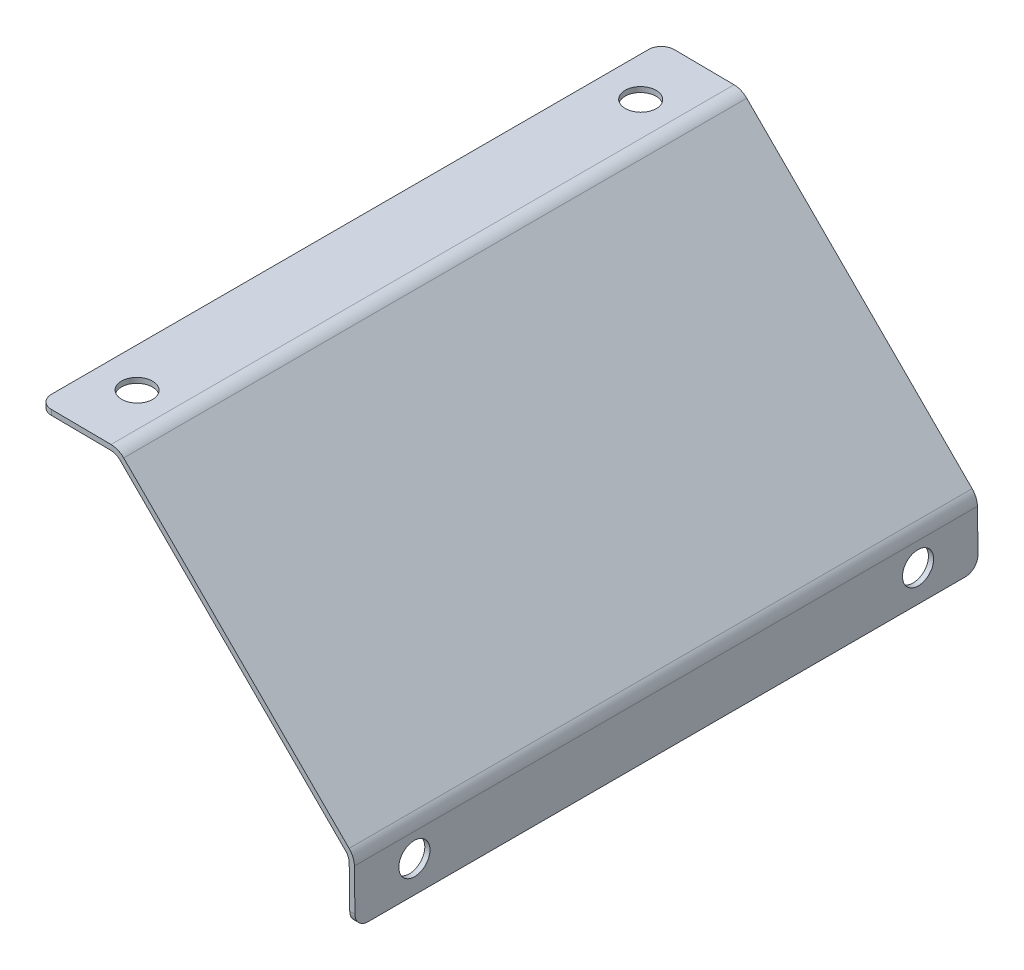
ISO-10303-21;
HEADER;
FILE_DESCRIPTION(('STEP AP214'),'2;1');
FILE_NAME('part.step','',(''),(''),'','','');
FILE_SCHEMA(('AUTOMOTIVE_DESIGN { 1 0 10303 214 1 1 1 1 }'));
ENDSEC;
DATA;
#1=APPLICATION_CONTEXT('core data for automotive mechanical design processes');
#2=APPLICATION_PROTOCOL_DEFINITION('international standard','automotive_design',2000,#1);
#3=PRODUCT_CONTEXT('',#1,'mechanical');
#4=PRODUCT('Part','Part','',(#3));
#5=PRODUCT_RELATED_PRODUCT_CATEGORY('part','',(#4));
#6=PRODUCT_DEFINITION_FORMATION('','',#4);
#7=PRODUCT_DEFINITION_CONTEXT('part definition',#1,'design');
#8=PRODUCT_DEFINITION('design','',#6,#7);
#9=PRODUCT_DEFINITION_SHAPE('','',#8);
#10=(LENGTH_UNIT() NAMED_UNIT(*) SI_UNIT(.MILLI.,.METRE.));
#11=(NAMED_UNIT(*) PLANE_ANGLE_UNIT() SI_UNIT($,.RADIAN.));
#12=(NAMED_UNIT(*) SI_UNIT($,.STERADIAN.) SOLID_ANGLE_UNIT());
#13=UNCERTAINTY_MEASURE_WITH_UNIT(LENGTH_MEASURE(1.E-05),#10,'distance_accuracy_value','');
#14=(GEOMETRIC_REPRESENTATION_CONTEXT(3) GLOBAL_UNCERTAINTY_ASSIGNED_CONTEXT((#13)) GLOBAL_UNIT_ASSIGNED_CONTEXT((#10,
#11,#12)) REPRESENTATION_CONTEXT('',''));
#15=CARTESIAN_POINT('',(0.,0.,0.));
#16=DIRECTION('',(0.,0.,1.));
#17=DIRECTION('',(1.,0.,0.));
#18=AXIS2_PLACEMENT_3D('',#15,#16,#17);
#19=CARTESIAN_POINT('',(114.734409216363,27.9027269042712,287.657206746833));
#20=DIRECTION('',(0.,0.,-1.));
#21=DIRECTION('',(-1.,0.,0.));
#22=AXIS2_PLACEMENT_3D('',#19,#20,#21);
#23=CYLINDRICAL_SURFACE('',#22,5.);
#24=DIRECTION('',(0.,0.,-1.));
#25=VECTOR('',#24,1.);
#26=CARTESIAN_POINT('',(119.734006878612,27.966155727616,287.657206746833));
#27=LINE('',#26,#25);
#28=CARTESIAN_POINT('',(119.734006878612,27.966155727616,120.));
#29=VERTEX_POINT('',#28);
#30=CARTESIAN_POINT('',(119.734006878612,27.966155727616,-120.));
#31=VERTEX_POINT('',#30);
#32=EDGE_CURVE('E162',#29,#31,#27,.T.);
#33=ORIENTED_EDGE('',*,*,#32,.F.);
#34=CARTESIAN_POINT('',(114.734409216363,27.9027269042712,120.));
#35=DIRECTION('',(0.,0.,-1.));
#36=DIRECTION('',(-1.,0.,0.));
#37=AXIS2_PLACEMENT_3D('',#34,#35,#36);
#38=CIRCLE('',#37,5.);
#39=CARTESIAN_POINT('',(118.269943122295,31.438260810204,120.));
#40=VERTEX_POINT('',#39);
#41=EDGE_CURVE('E157',#29,#40,#38,.F.);
#42=ORIENTED_EDGE('',*,*,#41,.T.);
#43=DIRECTION('',(0.,0.,-1.));
#44=VECTOR('',#43,1.);
#45=CARTESIAN_POINT('',(118.269943122295,31.438260810204,287.657206746833));
#46=LINE('',#45,#44);
#47=CARTESIAN_POINT('',(118.269943122295,31.438260810204,-120.));
#48=VERTEX_POINT('',#47);
#49=EDGE_CURVE('E152',#40,#48,#46,.T.);
#50=ORIENTED_EDGE('',*,*,#49,.T.);
#51=CARTESIAN_POINT('',(114.734409216363,27.9027269042712,-120.));
#52=DIRECTION('',(0.,0.,1.));
#53=DIRECTION('',(1.,0.,0.));
#54=AXIS2_PLACEMENT_3D('',#51,#52,#53);
#55=CIRCLE('',#54,5.);
#56=EDGE_CURVE('E155',#31,#48,#55,.T.);
#57=ORIENTED_EDGE('',*,*,#56,.F.);
#58=EDGE_LOOP('',(#33,#42,#50,#57));
#59=FACE_BOUND('',#58,.T.);
#60=ADVANCED_FACE('F35',(#59),#23,.F.);
#61=CARTESIAN_POINT('',(31.444362751566,118.263841180933,287.657206746833));
#62=DIRECTION('',(0.707106781186548,0.707106781186547,0.));
#63=DIRECTION('',(-0.707106781186547,0.707106781186548,0.));
#64=AXIS2_PLACEMENT_3D('',#61,#62,#63);
#65=PLANE('',#64);
#66=ORIENTED_EDGE('',*,*,#49,.F.);
#67=DIRECTION('',(-0.707106781186547,0.707106781186548,0.));
#68=VECTOR('',#67,1.);
#69=CARTESIAN_POINT('',(31.4443627515659,118.263841180933,120.));
#70=LINE('',#69,#68);
#71=CARTESIAN_POINT('',(31.444362751566,118.263841180933,120.));
#72=VERTEX_POINT('',#71);
#73=EDGE_CURVE('E182',#40,#72,#70,.T.);
#74=ORIENTED_EDGE('',*,*,#73,.T.);
#75=DIRECTION('',(0.,0.,-1.));
#76=VECTOR('',#75,1.);
#77=CARTESIAN_POINT('',(31.444362751566,118.263841180933,287.657206746833));
#78=LINE('',#77,#76);
#79=CARTESIAN_POINT('',(31.444362751566,118.263841180933,-120.));
#80=VERTEX_POINT('',#79);
#81=EDGE_CURVE('E161',#72,#80,#78,.T.);
#82=ORIENTED_EDGE('',*,*,#81,.T.);
#83=DIRECTION('',(-0.707106781186547,0.707106781186548,0.));
#84=VECTOR('',#83,1.);
#85=CARTESIAN_POINT('',(31.4443627515659,118.263841180933,-120.));
#86=LINE('',#85,#84);
#87=EDGE_CURVE('E167',#48,#80,#86,.T.);
#88=ORIENTED_EDGE('',*,*,#87,.F.);
#89=EDGE_LOOP('',(#66,#74,#82,#88));
#90=FACE_BOUND('',#89,.T.);
#91=ADVANCED_FACE('F173',(#90),#65,.F.);
#92=CARTESIAN_POINT('',(27.9088288456332,114.728307275001,287.657206746833));
#93=DIRECTION('',(0.,0.,-1.));
#94=DIRECTION('',(-1.,0.,0.));
#95=AXIS2_PLACEMENT_3D('',#92,#93,#94);
#96=CYLINDRICAL_SURFACE('',#95,5.00000000000001);
#97=ORIENTED_EDGE('',*,*,#81,.F.);
#98=CARTESIAN_POINT('',(27.9088288456332,114.728307275001,120.));
#99=DIRECTION('',(0.,0.,-1.));
#100=DIRECTION('',(-1.,0.,0.));
#101=AXIS2_PLACEMENT_3D('',#98,#99,#100);
#102=CIRCLE('',#101,5.00000000000001);
#103=CARTESIAN_POINT('',(27.9574592232539,119.728070778045,120.));
#104=VERTEX_POINT('',#103);
#105=EDGE_CURVE('E184',#72,#104,#102,.F.);
#106=ORIENTED_EDGE('',*,*,#105,.T.);
#107=DIRECTION('',(0.,0.,-1.));
#108=VECTOR('',#107,1.);
#109=CARTESIAN_POINT('',(27.9574592232539,119.728070778045,287.657206746833));
#110=LINE('',#109,#108);
#111=CARTESIAN_POINT('',(27.9574592232539,119.728070778045,-120.));
#112=VERTEX_POINT('',#111);
#113=EDGE_CURVE('E206',#104,#112,#110,.T.);
#114=ORIENTED_EDGE('',*,*,#113,.T.);
#115=CARTESIAN_POINT('',(27.9088288456332,114.728307275001,-120.));
#116=DIRECTION('',(0.,0.,1.));
#117=DIRECTION('',(1.,0.,0.));
#118=AXIS2_PLACEMENT_3D('',#115,#116,#117);
#119=CIRCLE('',#118,5.00000000000001);
#120=EDGE_CURVE('E175',#80,#112,#119,.T.);
#121=ORIENTED_EDGE('',*,*,#120,.F.);
#122=EDGE_LOOP('',(#97,#106,#114,#121));
#123=FACE_BOUND('',#122,.T.);
#124=ADVANCED_FACE('F341',(#123),#96,.F.);
#125=CARTESIAN_POINT('',(0.,120.,287.657206746833));
#126=DIRECTION('',(0.00972607552414292,0.999952700608833,0.));
#127=DIRECTION('',(-0.999952700608833,0.00972607552414292,0.));
#128=AXIS2_PLACEMENT_3D('',#125,#126,#127);
#129=PLANE('',#128);
#130=CARTESIAN_POINT('',(14.9985810518235,119.8541157677,-97.));
#131=DIRECTION('',(0.00972607552414292,0.999952700608833,0.));
#132=DIRECTION('',(-0.999952700608833,0.00972607552414292,0.));
#133=AXIS2_PLACEMENT_3D('',#130,#131,#132);
#134=CIRCLE('',#133,6.);
#135=CARTESIAN_POINT('',(8.99886484817047,119.912472220844,-97.));
#136=VERTEX_POINT('',#135);
#137=EDGE_CURVE('E382',#136,#136,#134,.T.);
#138=ORIENTED_EDGE('',*,*,#137,.T.);
#139=EDGE_LOOP('',(#138));
#140=FACE_BOUND('',#139,.T.);
#141=CARTESIAN_POINT('',(14.9985810518235,119.8541157677,97.));
#142=DIRECTION('',(0.00972607552414292,0.999952700608833,0.));
#143=DIRECTION('',(-0.999952700608833,0.00972607552414292,0.));
#144=AXIS2_PLACEMENT_3D('',#141,#142,#143);
#145=CIRCLE('',#144,6.);
#146=CARTESIAN_POINT('',(8.99886484817047,119.912472220844,97.));
#147=VERTEX_POINT('',#146);
#148=EDGE_CURVE('E386',#147,#147,#145,.T.);
#149=ORIENTED_EDGE('',*,*,#148,.T.);
#150=EDGE_LOOP('',(#149));
#151=FACE_BOUND('',#150,.T.);
#152=DIRECTION('',(-0.999952700608833,0.00972607552414292,0.));
#153=VECTOR('',#152,1.);
#154=CARTESIAN_POINT('',(0.,120.,120.));
#155=LINE('',#154,#153);
#156=CARTESIAN_POINT('',(4.99976350304416,119.951369622379,120.));
#157=VERTEX_POINT('',#156);
#158=EDGE_CURVE('E187',#104,#157,#155,.T.);
#159=ORIENTED_EDGE('',*,*,#158,.T.);
#160=CARTESIAN_POINT('',(4.99976350304416,119.951369622379,115.));
#161=DIRECTION('',(0.00972607552414292,0.999952700608833,0.));
#162=DIRECTION('',(-0.999952700608833,0.00972607552414292,0.));
#163=AXIS2_PLACEMENT_3D('',#160,#161,#162);
#164=CIRCLE('',#163,5.);
#165=CARTESIAN_POINT('',(0.,120.,115.));
#166=VERTEX_POINT('',#165);
#167=EDGE_CURVE('E251',#157,#166,#164,.F.);
#168=ORIENTED_EDGE('',*,*,#167,.T.);
#169=DIRECTION('',(0.,0.,-1.));
#170=VECTOR('',#169,1.);
#171=CARTESIAN_POINT('',(0.,120.,287.657206746833));
#172=LINE('',#171,#170);
#173=CARTESIAN_POINT('',(0.,120.,-115.));
#174=VERTEX_POINT('',#173);
#175=EDGE_CURVE('E208',#166,#174,#172,.T.);
#176=ORIENTED_EDGE('',*,*,#175,.T.);
#177=CARTESIAN_POINT('',(4.99976350304416,119.951369622379,-115.));
#178=DIRECTION('',(0.00972607552414292,0.999952700608833,0.));
#179=DIRECTION('',(-0.999952700608833,0.00972607552414292,0.));
#180=AXIS2_PLACEMENT_3D('',#177,#178,#179);
#181=CIRCLE('',#180,5.);
#182=CARTESIAN_POINT('',(4.99976350304417,119.951369622379,-120.));
#183=VERTEX_POINT('',#182);
#184=EDGE_CURVE('E249',#174,#183,#181,.F.);
#185=ORIENTED_EDGE('',*,*,#184,.T.);
#186=DIRECTION('',(-0.999952700608833,0.00972607552414292,0.));
#187=VECTOR('',#186,1.);
#188=CARTESIAN_POINT('',(0.,120.,-120.));
#189=LINE('',#188,#187);
#190=EDGE_CURVE('E177',#112,#183,#189,.T.);
#191=ORIENTED_EDGE('',*,*,#190,.F.);
#192=ORIENTED_EDGE('',*,*,#113,.F.);
#193=EDGE_LOOP('',(#159,#168,#176,#185,#191,#192));
#194=FACE_BOUND('',#193,.T.);
#195=ADVANCED_FACE('F294',(#140,#151,#194),#129,.F.);
#196=CARTESIAN_POINT('',(0.,120.,287.657206746833));
#197=DIRECTION('',(-0.999952700608833,0.00972607552414292,0.));
#198=DIRECTION('',(-0.00972607552414292,-0.999952700608833,0.));
#199=AXIS2_PLACEMENT_3D('',#196,#197,#198);
#200=PLANE('',#199);
#201=ORIENTED_EDGE('',*,*,#175,.F.);
#202=DIRECTION('',(-0.00972607552414292,-0.999952700608833,0.));
#203=VECTOR('',#202,1.);
#204=CARTESIAN_POINT('',(0.0194521510482842,121.999905401218,115.));
#205=LINE('',#204,#203);
#206=CARTESIAN_POINT('',(0.0194521510482842,121.999905401218,115.));
#207=VERTEX_POINT('',#206);
#208=EDGE_CURVE('E256',#166,#207,#205,.F.);
#209=ORIENTED_EDGE('',*,*,#208,.T.);
#210=DIRECTION('',(0.,0.,-1.));
#211=VECTOR('',#210,1.);
#212=CARTESIAN_POINT('',(0.0194521510482842,121.999905401218,287.657206746833));
#213=LINE('',#212,#211);
#214=CARTESIAN_POINT('',(0.0194521510482842,121.999905401218,-115.));
#215=VERTEX_POINT('',#214);
#216=EDGE_CURVE('E211',#207,#215,#213,.T.);
#217=ORIENTED_EDGE('',*,*,#216,.T.);
#218=DIRECTION('',(-0.00972607552414292,-0.999952700608833,0.));
#219=VECTOR('',#218,1.);
#220=CARTESIAN_POINT('',(0.,120.,-115.));
#221=LINE('',#220,#219);
#222=EDGE_CURVE('E253',#215,#174,#221,.T.);
#223=ORIENTED_EDGE('',*,*,#222,.T.);
#224=EDGE_LOOP('',(#201,#209,#217,#223));
#225=FACE_BOUND('',#224,.T.);
#226=ADVANCED_FACE('F292',(#225),#200,.T.);
#227=CARTESIAN_POINT('',(0.0194521510482842,121.999905401218,287.657206746833));
#228=DIRECTION('',(0.00972607552414292,0.999952700608833,0.));
#229=DIRECTION('',(-0.999952700608833,0.00972607552414292,0.));
#230=AXIS2_PLACEMENT_3D('',#227,#228,#229);
#231=PLANE('',#230);
#232=CARTESIAN_POINT('',(15.0180332028718,121.854021168917,-97.));
#233=DIRECTION('',(0.00972607552414292,0.999952700608833,0.));
#234=DIRECTION('',(-0.999952700608833,0.00972607552414292,0.));
#235=AXIS2_PLACEMENT_3D('',#232,#233,#234);
#236=CIRCLE('',#235,6.);
#237=CARTESIAN_POINT('',(9.01831699921876,121.912377622062,-97.));
#238=VERTEX_POINT('',#237);
#239=EDGE_CURVE('E379',#238,#238,#236,.T.);
#240=ORIENTED_EDGE('',*,*,#239,.F.);
#241=EDGE_LOOP('',(#240));
#242=FACE_BOUND('',#241,.T.);
#243=CARTESIAN_POINT('',(15.0180332028718,121.854021168917,97.));
#244=DIRECTION('',(0.00972607552414292,0.999952700608833,0.));
#245=DIRECTION('',(-0.999952700608833,0.00972607552414292,0.));
#246=AXIS2_PLACEMENT_3D('',#243,#244,#245);
#247=CIRCLE('',#246,6.);
#248=CARTESIAN_POINT('',(9.01831699921876,121.912377622062,97.));
#249=VERTEX_POINT('',#248);
#250=EDGE_CURVE('E383',#249,#249,#247,.T.);
#251=ORIENTED_EDGE('',*,*,#250,.F.);
#252=EDGE_LOOP('',(#251));
#253=FACE_BOUND('',#252,.T.);
#254=ORIENTED_EDGE('',*,*,#216,.F.);
#255=CARTESIAN_POINT('',(5.01921565409245,121.951275023597,115.));
#256=DIRECTION('',(0.00972607552414292,0.999952700608833,0.));
#257=DIRECTION('',(-0.999952700608833,0.00972607552414292,0.));
#258=AXIS2_PLACEMENT_3D('',#255,#256,#257);
#259=CIRCLE('',#258,5.);
#260=CARTESIAN_POINT('',(5.01921565409245,121.951275023597,120.));
#261=VERTEX_POINT('',#260);
#262=EDGE_CURVE('E44',#207,#261,#259,.T.);
#263=ORIENTED_EDGE('',*,*,#262,.T.);
#264=DIRECTION('',(-0.999952700608833,0.00972607552414292,0.));
#265=VECTOR('',#264,1.);
#266=CARTESIAN_POINT('',(0.0194521510482454,121.999905401218,120.));
#267=LINE('',#266,#265);
#268=CARTESIAN_POINT('',(27.9769113743022,121.727976179263,120.));
#269=VERTEX_POINT('',#268);
#270=EDGE_CURVE('E190',#269,#261,#267,.T.);
#271=ORIENTED_EDGE('',*,*,#270,.F.);
#272=DIRECTION('',(0.,0.,-1.));
#273=VECTOR('',#272,1.);
#274=CARTESIAN_POINT('',(27.9769113743022,121.727976179262,287.657206746833));
#275=LINE('',#274,#273);
#276=CARTESIAN_POINT('',(27.9769113743022,121.727976179262,-120.));
#277=VERTEX_POINT('',#276);
#278=EDGE_CURVE('E213',#269,#277,#275,.T.);
#279=ORIENTED_EDGE('',*,*,#278,.T.);
#280=DIRECTION('',(-0.999952700608833,0.00972607552414292,0.));
#281=VECTOR('',#280,1.);
#282=CARTESIAN_POINT('',(0.0194521510482454,121.999905401218,-120.));
#283=LINE('',#282,#281);
#284=CARTESIAN_POINT('',(5.01921565409245,121.951275023597,-120.));
#285=VERTEX_POINT('',#284);
#286=EDGE_CURVE('E284',#277,#285,#283,.T.);
#287=ORIENTED_EDGE('',*,*,#286,.T.);
#288=CARTESIAN_POINT('',(5.01921565409245,121.951275023597,-115.));
#289=DIRECTION('',(0.00972607552414292,0.999952700608833,0.));
#290=DIRECTION('',(-0.999952700608833,0.00972607552414292,0.));
#291=AXIS2_PLACEMENT_3D('',#288,#289,#290);
#292=CIRCLE('',#291,5.);
#293=EDGE_CURVE('E57',#285,#215,#292,.T.);
#294=ORIENTED_EDGE('',*,*,#293,.T.);
#295=EDGE_LOOP('',(#254,#263,#271,#279,#287,#294));
#296=FACE_BOUND('',#295,.T.);
#297=ADVANCED_FACE('F304',(#242,#253,#296),#231,.T.);
#298=CARTESIAN_POINT('',(27.9088288456332,114.728307275001,287.657206746833));
#299=DIRECTION('',(0.,0.,-1.));
#300=DIRECTION('',(-1.,0.,0.));
#301=AXIS2_PLACEMENT_3D('',#298,#299,#300);
#302=CYLINDRICAL_SURFACE('',#301,7.00000000000001);
#303=CARTESIAN_POINT('',(27.9088288456332,114.728307275001,120.));
#304=DIRECTION('',(0.,0.,-1.));
#305=DIRECTION('',(-1.,0.,0.));
#306=AXIS2_PLACEMENT_3D('',#303,#304,#305);
#307=CIRCLE('',#306,7.00000000000001);
#308=CARTESIAN_POINT('',(32.8585763139391,119.678054743307,120.));
#309=VERTEX_POINT('',#308);
#310=EDGE_CURVE('E193',#309,#269,#307,.F.);
#311=ORIENTED_EDGE('',*,*,#310,.F.);
#312=DIRECTION('',(0.,0.,-1.));
#313=VECTOR('',#312,1.);
#314=CARTESIAN_POINT('',(32.858576313939,119.678054743306,287.657206746833));
#315=LINE('',#314,#313);
#316=CARTESIAN_POINT('',(32.858576313939,119.678054743306,-120.));
#317=VERTEX_POINT('',#316);
#318=EDGE_CURVE('E215',#309,#317,#315,.T.);
#319=ORIENTED_EDGE('',*,*,#318,.T.);
#320=CARTESIAN_POINT('',(27.9088288456332,114.728307275001,-120.));
#321=DIRECTION('',(0.,0.,1.));
#322=DIRECTION('',(1.,0.,0.));
#323=AXIS2_PLACEMENT_3D('',#320,#321,#322);
#324=CIRCLE('',#323,7.00000000000001);
#325=EDGE_CURVE('E281',#317,#277,#324,.T.);
#326=ORIENTED_EDGE('',*,*,#325,.T.);
#327=ORIENTED_EDGE('',*,*,#278,.F.);
#328=EDGE_LOOP('',(#311,#319,#326,#327));
#329=FACE_BOUND('',#328,.T.);
#330=ADVANCED_FACE('F308',(#329),#302,.T.);
#331=CARTESIAN_POINT('',(32.858576313939,119.678054743306,287.657206746833));
#332=DIRECTION('',(0.707106781186548,0.707106781186547,0.));
#333=DIRECTION('',(-0.707106781186547,0.707106781186548,0.));
#334=AXIS2_PLACEMENT_3D('',#331,#332,#333);
#335=PLANE('',#334);
#336=DIRECTION('',(-0.707106781186547,0.707106781186548,0.));
#337=VECTOR('',#336,1.);
#338=CARTESIAN_POINT('',(32.858576313939,119.678054743307,120.));
#339=LINE('',#338,#337);
#340=CARTESIAN_POINT('',(119.684156684668,32.8524743725771,120.));
#341=VERTEX_POINT('',#340);
#342=EDGE_CURVE('E195',#341,#309,#339,.T.);
#343=ORIENTED_EDGE('',*,*,#342,.F.);
#344=DIRECTION('',(0.,0.,-1.));
#345=VECTOR('',#344,1.);
#346=CARTESIAN_POINT('',(119.684156684668,32.8524743725771,287.657206746833));
#347=LINE('',#346,#345);
#348=CARTESIAN_POINT('',(119.684156684668,32.8524743725771,-120.));
#349=VERTEX_POINT('',#348);
#350=EDGE_CURVE('E217',#341,#349,#347,.T.);
#351=ORIENTED_EDGE('',*,*,#350,.T.);
#352=DIRECTION('',(-0.707106781186547,0.707106781186548,0.));
#353=VECTOR('',#352,1.);
#354=CARTESIAN_POINT('',(32.858576313939,119.678054743307,-120.));
#355=LINE('',#354,#353);
#356=EDGE_CURVE('E278',#349,#317,#355,.T.);
#357=ORIENTED_EDGE('',*,*,#356,.T.);
#358=ORIENTED_EDGE('',*,*,#318,.F.);
#359=EDGE_LOOP('',(#343,#351,#357,#358));
#360=FACE_BOUND('',#359,.T.);
#361=ADVANCED_FACE('F312',(#360),#335,.T.);
#362=CARTESIAN_POINT('',(114.734409216363,27.9027269042712,287.657206746833));
#363=DIRECTION('',(0.,0.,-1.));
#364=DIRECTION('',(-1.,0.,0.));
#365=AXIS2_PLACEMENT_3D('',#362,#363,#364);
#366=CYLINDRICAL_SURFACE('',#365,7.);
#367=CARTESIAN_POINT('',(114.734409216363,27.9027269042712,120.));
#368=DIRECTION('',(0.,0.,-1.));
#369=DIRECTION('',(-1.,0.,0.));
#370=AXIS2_PLACEMENT_3D('',#367,#368,#369);
#371=CIRCLE('',#370,7.);
#372=CARTESIAN_POINT('',(121.733845943512,27.9915272569539,120.));
#373=VERTEX_POINT('',#372);
#374=EDGE_CURVE('E197',#373,#341,#371,.F.);
#375=ORIENTED_EDGE('',*,*,#374,.F.);
#376=DIRECTION('',(0.,0.,-1.));
#377=VECTOR('',#376,1.);
#378=CARTESIAN_POINT('',(121.733845943512,27.9915272569539,287.657206746833));
#379=LINE('',#378,#377);
#380=CARTESIAN_POINT('',(121.733845943512,27.9915272569539,-120.));
#381=VERTEX_POINT('',#380);
#382=EDGE_CURVE('E219',#373,#381,#379,.T.);
#383=ORIENTED_EDGE('',*,*,#382,.T.);
#384=CARTESIAN_POINT('',(114.734409216363,27.9027269042712,-120.));
#385=DIRECTION('',(0.,0.,1.));
#386=DIRECTION('',(1.,0.,0.));
#387=AXIS2_PLACEMENT_3D('',#384,#385,#386);
#388=CIRCLE('',#387,7.);
#389=EDGE_CURVE('E265',#381,#349,#388,.T.);
#390=ORIENTED_EDGE('',*,*,#389,.T.);
#391=ORIENTED_EDGE('',*,*,#350,.F.);
#392=EDGE_LOOP('',(#375,#383,#390,#391));
#393=FACE_BOUND('',#392,.T.);
#394=ADVANCED_FACE('F318',(#393),#366,.T.);
#395=CARTESIAN_POINT('',(121.733845943512,27.9915272569539,287.657206746833));
#396=DIRECTION('',(0.999919532449869,0.0126857646689544,0.));
#397=DIRECTION('',(-0.0126857646689544,0.999919532449869,0.));
#398=AXIS2_PLACEMENT_3D('',#395,#396,#397);
#399=PLANE('',#398);
#400=CARTESIAN_POINT('',(121.847622138381,19.0234403858351,-97.));
#401=DIRECTION('',(0.999919532449869,0.0126857646689544,0.));
#402=DIRECTION('',(-0.0126857646689544,0.999919532449869,0.));
#403=AXIS2_PLACEMENT_3D('',#400,#401,#402);
#404=CIRCLE('',#403,6.);
#405=CARTESIAN_POINT('',(121.771507550367,25.0229575805343,-97.));
#406=VERTEX_POINT('',#405);
#407=EDGE_CURVE('E272',#406,#406,#404,.T.);
#408=ORIENTED_EDGE('',*,*,#407,.F.);
#409=EDGE_LOOP('',(#408));
#410=FACE_BOUND('',#409,.T.);
#411=CARTESIAN_POINT('',(121.847622138381,19.0234403858351,97.));
#412=DIRECTION('',(0.999919532449869,0.0126857646689544,0.));
#413=DIRECTION('',(-0.0126857646689544,0.999919532449869,0.));
#414=AXIS2_PLACEMENT_3D('',#411,#412,#413);
#415=CIRCLE('',#414,6.);
#416=CARTESIAN_POINT('',(121.771507550367,25.0229575805343,97.));
#417=VERTEX_POINT('',#416);
#418=EDGE_CURVE('E262',#417,#417,#415,.T.);
#419=ORIENTED_EDGE('',*,*,#418,.F.);
#420=EDGE_LOOP('',(#419));
#421=FACE_BOUND('',#420,.T.);
#422=DIRECTION('',(0.,0.,-1.));
#423=VECTOR('',#422,1.);
#424=CARTESIAN_POINT('',(121.9998390649,7.02537152933791,287.657206746833));
#425=LINE('',#424,#423);
#426=CARTESIAN_POINT('',(121.9998390649,7.02537152933791,115.));
#427=VERTEX_POINT('',#426);
#428=CARTESIAN_POINT('',(121.9998390649,7.02537152933791,-115.));
#429=VERTEX_POINT('',#428);
#430=EDGE_CURVE('E222',#427,#429,#425,.T.);
#431=ORIENTED_EDGE('',*,*,#430,.T.);
#432=CARTESIAN_POINT('',(121.936410241555,12.0249691915873,-115.));
#433=DIRECTION('',(0.999919532449869,0.0126857646689544,0.));
#434=DIRECTION('',(-0.0126857646689544,0.999919532449869,0.));
#435=AXIS2_PLACEMENT_3D('',#432,#433,#434);
#436=CIRCLE('',#435,5.);
#437=CARTESIAN_POINT('',(121.936410241555,12.0249691915872,-120.));
#438=VERTEX_POINT('',#437);
#439=EDGE_CURVE('E235',#429,#438,#436,.T.);
#440=ORIENTED_EDGE('',*,*,#439,.T.);
#441=DIRECTION('',(-0.0126857646689544,0.999919532449869,0.));
#442=VECTOR('',#441,1.);
#443=CARTESIAN_POINT('',(121.733845943512,27.9915272569539,-120.));
#444=LINE('',#443,#442);
#445=EDGE_CURVE('E261',#438,#381,#444,.T.);
#446=ORIENTED_EDGE('',*,*,#445,.T.);
#447=ORIENTED_EDGE('',*,*,#382,.F.);
#448=DIRECTION('',(-0.0126857646689544,0.999919532449869,0.));
#449=VECTOR('',#448,1.);
#450=CARTESIAN_POINT('',(121.733845943512,27.9915272569539,120.));
#451=LINE('',#450,#449);
#452=CARTESIAN_POINT('',(121.936410241555,12.0249691915873,120.));
#453=VERTEX_POINT('',#452);
#454=EDGE_CURVE('E199',#453,#373,#451,.T.);
#455=ORIENTED_EDGE('',*,*,#454,.F.);
#456=CARTESIAN_POINT('',(121.936410241555,12.0249691915873,115.));
#457=DIRECTION('',(0.999919532449869,0.0126857646689544,0.));
#458=DIRECTION('',(-0.0126857646689544,0.999919532449869,0.));
#459=AXIS2_PLACEMENT_3D('',#456,#457,#458);
#460=CIRCLE('',#459,5.);
#461=EDGE_CURVE('E233',#453,#427,#460,.T.);
#462=ORIENTED_EDGE('',*,*,#461,.T.);
#463=EDGE_LOOP('',(#431,#440,#446,#447,#455,#462));
#464=FACE_BOUND('',#463,.T.);
#465=ADVANCED_FACE('F322',(#410,#421,#464),#399,.T.);
#466=CARTESIAN_POINT('',(121.9998390649,7.02537152933791,287.657206746833));
#467=DIRECTION('',(0.012685764668955,-0.999919532449869,0.));
#468=DIRECTION('',(0.999919532449869,0.012685764668955,0.));
#469=AXIS2_PLACEMENT_3D('',#466,#467,#468);
#470=PLANE('',#469);
#471=DIRECTION('',(0.,0.,-1.));
#472=VECTOR('',#471,1.);
#473=CARTESIAN_POINT('',(120.,7.,287.657206746833));
#474=LINE('',#473,#472);
#475=CARTESIAN_POINT('',(120.,7.,115.));
#476=VERTEX_POINT('',#475);
#477=CARTESIAN_POINT('',(120.,7.,-115.));
#478=VERTEX_POINT('',#477);
#479=EDGE_CURVE('E225',#476,#478,#474,.T.);
#480=ORIENTED_EDGE('',*,*,#479,.T.);
#481=DIRECTION('',(0.999919532449869,0.012685764668955,0.));
#482=VECTOR('',#481,1.);
#483=CARTESIAN_POINT('',(121.9998390649,7.02537152933791,-115.));
#484=LINE('',#483,#482);
#485=EDGE_CURVE('E230',#478,#429,#484,.T.);
#486=ORIENTED_EDGE('',*,*,#485,.T.);
#487=ORIENTED_EDGE('',*,*,#430,.F.);
#488=DIRECTION('',(0.999919532449869,0.012685764668955,0.));
#489=VECTOR('',#488,1.);
#490=CARTESIAN_POINT('',(120.,7.,115.));
#491=LINE('',#490,#489);
#492=EDGE_CURVE('E203',#427,#476,#491,.F.);
#493=ORIENTED_EDGE('',*,*,#492,.T.);
#494=EDGE_LOOP('',(#480,#486,#487,#493));
#495=FACE_BOUND('',#494,.T.);
#496=ADVANCED_FACE('F333',(#495),#470,.T.);
#497=CARTESIAN_POINT('',(119.734006878612,27.966155727616,287.657206746833));
#498=DIRECTION('',(0.999919532449869,0.0126857646689544,0.));
#499=DIRECTION('',(-0.0126857646689544,0.999919532449869,0.));
#500=AXIS2_PLACEMENT_3D('',#497,#498,#499);
#501=PLANE('',#500);
#502=CARTESIAN_POINT('',(119.847783073481,18.9980688564972,-97.));
#503=DIRECTION('',(0.999919532449869,0.0126857646689544,0.));
#504=DIRECTION('',(-0.0126857646689544,0.999919532449869,0.));
#505=AXIS2_PLACEMENT_3D('',#502,#503,#504);
#506=CIRCLE('',#505,6.);
#507=CARTESIAN_POINT('',(119.771668485468,24.9975860511964,-97.));
#508=VERTEX_POINT('',#507);
#509=EDGE_CURVE('E39',#508,#508,#506,.T.);
#510=ORIENTED_EDGE('',*,*,#509,.T.);
#511=EDGE_LOOP('',(#510));
#512=FACE_BOUND('',#511,.T.);
#513=CARTESIAN_POINT('',(119.847783073481,18.9980688564972,97.));
#514=DIRECTION('',(0.999919532449869,0.0126857646689544,0.));
#515=DIRECTION('',(-0.0126857646689544,0.999919532449869,0.));
#516=AXIS2_PLACEMENT_3D('',#513,#514,#515);
#517=CIRCLE('',#516,6.);
#518=CARTESIAN_POINT('',(119.771668485468,24.9975860511964,97.));
#519=VERTEX_POINT('',#518);
#520=EDGE_CURVE('E259',#519,#519,#517,.T.);
#521=ORIENTED_EDGE('',*,*,#520,.T.);
#522=EDGE_LOOP('',(#521));
#523=FACE_BOUND('',#522,.T.);
#524=DIRECTION('',(-0.0126857646689544,0.999919532449869,0.));
#525=VECTOR('',#524,1.);
#526=CARTESIAN_POINT('',(119.734006878612,27.966155727616,-120.));
#527=LINE('',#526,#525);
#528=CARTESIAN_POINT('',(119.936571176655,11.9995976622493,-120.));
#529=VERTEX_POINT('',#528);
#530=EDGE_CURVE('E170',#529,#31,#527,.T.);
#531=ORIENTED_EDGE('',*,*,#530,.F.);
#532=CARTESIAN_POINT('',(119.936571176655,11.9995976622493,-115.));
#533=DIRECTION('',(0.999919532449869,0.0126857646689544,0.));
#534=DIRECTION('',(-0.0126857646689544,0.999919532449869,0.));
#535=AXIS2_PLACEMENT_3D('',#532,#533,#534);
#536=CIRCLE('',#535,5.);
#537=EDGE_CURVE('E241',#529,#478,#536,.F.);
#538=ORIENTED_EDGE('',*,*,#537,.T.);
#539=ORIENTED_EDGE('',*,*,#479,.F.);
#540=CARTESIAN_POINT('',(119.936571176655,11.9995976622493,115.));
#541=DIRECTION('',(0.999919532449869,0.0126857646689544,0.));
#542=DIRECTION('',(-0.0126857646689544,0.999919532449869,0.));
#543=AXIS2_PLACEMENT_3D('',#540,#541,#542);
#544=CIRCLE('',#543,5.);
#545=CARTESIAN_POINT('',(119.936571176655,11.9995976622493,120.));
#546=VERTEX_POINT('',#545);
#547=EDGE_CURVE('E239',#476,#546,#544,.F.);
#548=ORIENTED_EDGE('',*,*,#547,.T.);
#549=DIRECTION('',(-0.0126857646689544,0.999919532449869,0.));
#550=VECTOR('',#549,1.);
#551=CARTESIAN_POINT('',(119.734006878612,27.966155727616,120.));
#552=LINE('',#551,#550);
#553=EDGE_CURVE('E201',#546,#29,#552,.T.);
#554=ORIENTED_EDGE('',*,*,#553,.T.);
#555=ORIENTED_EDGE('',*,*,#32,.T.);
#556=EDGE_LOOP('',(#531,#538,#539,#548,#554,#555));
#557=FACE_BOUND('',#556,.T.);
#558=ADVANCED_FACE('F330',(#512,#523,#557),#501,.F.);
#559=CARTESIAN_POINT('',(0.,0.,120.));
#560=DIRECTION('',(0.,0.,-1.));
#561=DIRECTION('',(-1.,0.,0.));
#562=AXIS2_PLACEMENT_3D('',#559,#560,#561);
#563=PLANE('',#562);
#564=ORIENTED_EDGE('',*,*,#270,.T.);
#565=DIRECTION('',(-0.00972607552414292,-0.999952700608833,0.));
#566=VECTOR('',#565,1.);
#567=CARTESIAN_POINT('',(4.99976350304416,119.951369622379,120.));
#568=LINE('',#567,#566);
#569=EDGE_CURVE('E246',#261,#157,#568,.T.);
#570=ORIENTED_EDGE('',*,*,#569,.T.);
#571=ORIENTED_EDGE('',*,*,#158,.F.);
#572=ORIENTED_EDGE('',*,*,#105,.F.);
#573=ORIENTED_EDGE('',*,*,#73,.F.);
#574=ORIENTED_EDGE('',*,*,#41,.F.);
#575=ORIENTED_EDGE('',*,*,#553,.F.);
#576=DIRECTION('',(0.999919532449869,0.012685764668955,0.));
#577=VECTOR('',#576,1.);
#578=CARTESIAN_POINT('',(121.936410241555,12.0249691915873,120.));
#579=LINE('',#578,#577);
#580=EDGE_CURVE('E243',#546,#453,#579,.T.);
#581=ORIENTED_EDGE('',*,*,#580,.T.);
#582=ORIENTED_EDGE('',*,*,#454,.T.);
#583=ORIENTED_EDGE('',*,*,#374,.T.);
#584=ORIENTED_EDGE('',*,*,#342,.T.);
#585=ORIENTED_EDGE('',*,*,#310,.T.);
#586=EDGE_LOOP('',(#564,#570,#571,#572,#573,#574,#575,#581,#582,#583,#584,#585));
#587=FACE_BOUND('',#586,.T.);
#588=ADVANCED_FACE('F300',(#587),#563,.F.);
#589=CARTESIAN_POINT('',(0.,0.,-120.));
#590=DIRECTION('',(0.,0.,1.));
#591=DIRECTION('',(-1.,0.,0.));
#592=AXIS2_PLACEMENT_3D('',#589,#590,#591);
#593=PLANE('',#592);
#594=ORIENTED_EDGE('',*,*,#190,.T.);
#595=DIRECTION('',(-0.00972607552414292,-0.999952700608833,0.));
#596=VECTOR('',#595,1.);
#597=CARTESIAN_POINT('',(5.01921565409245,121.951275023597,-120.));
#598=LINE('',#597,#596);
#599=EDGE_CURVE('E11',#183,#285,#598,.F.);
#600=ORIENTED_EDGE('',*,*,#599,.T.);
#601=ORIENTED_EDGE('',*,*,#286,.F.);
#602=ORIENTED_EDGE('',*,*,#325,.F.);
#603=ORIENTED_EDGE('',*,*,#356,.F.);
#604=ORIENTED_EDGE('',*,*,#389,.F.);
#605=ORIENTED_EDGE('',*,*,#445,.F.);
#606=DIRECTION('',(0.999919532449869,0.012685764668955,0.));
#607=VECTOR('',#606,1.);
#608=CARTESIAN_POINT('',(119.936571176655,11.9995976622493,-120.));
#609=LINE('',#608,#607);
#610=EDGE_CURVE('E237',#438,#529,#609,.F.);
#611=ORIENTED_EDGE('',*,*,#610,.T.);
#612=ORIENTED_EDGE('',*,*,#530,.T.);
#613=ORIENTED_EDGE('',*,*,#56,.T.);
#614=ORIENTED_EDGE('',*,*,#87,.T.);
#615=ORIENTED_EDGE('',*,*,#120,.T.);
#616=EDGE_LOOP('',(#594,#600,#601,#602,#603,#604,#605,#611,#612,#613,#614,#615));
#617=FACE_BOUND('',#616,.T.);
#618=ADVANCED_FACE('F165',(#617),#593,.F.);
#619=CARTESIAN_POINT('',(121.936410241555,12.0249691915873,-115.));
#620=DIRECTION('',(-0.999919532449869,-0.012685764668955,0.));
#621=DIRECTION('',(0.012685764668955,-0.999919532449869,0.));
#622=AXIS2_PLACEMENT_3D('',#619,#620,#621);
#623=CYLINDRICAL_SURFACE('',#622,5.);
#624=ORIENTED_EDGE('',*,*,#537,.F.);
#625=ORIENTED_EDGE('',*,*,#610,.F.);
#626=ORIENTED_EDGE('',*,*,#439,.F.);
#627=ORIENTED_EDGE('',*,*,#485,.F.);
#628=EDGE_LOOP('',(#624,#625,#626,#627));
#629=FACE_BOUND('',#628,.T.);
#630=ADVANCED_FACE('F326',(#629),#623,.T.);
#631=CARTESIAN_POINT('',(-0.132910595452297,10.4763018966866,115.));
#632=DIRECTION('',(-0.999919532449869,-0.012685764668955,0.));
#633=DIRECTION('',(0.012685764668955,-0.999919532449869,0.));
#634=AXIS2_PLACEMENT_3D('',#631,#632,#633);
#635=CYLINDRICAL_SURFACE('',#634,5.);
#636=ORIENTED_EDGE('',*,*,#547,.F.);
#637=ORIENTED_EDGE('',*,*,#492,.F.);
#638=ORIENTED_EDGE('',*,*,#461,.F.);
#639=ORIENTED_EDGE('',*,*,#580,.F.);
#640=EDGE_LOOP('',(#636,#637,#638,#639));
#641=FACE_BOUND('',#640,.T.);
#642=ADVANCED_FACE('F337',(#641),#635,.T.);
#643=CARTESIAN_POINT('',(3.8326896446411,-0.0372787922085547,115.));
#644=DIRECTION('',(0.00972607552414292,0.999952700608833,0.));
#645=DIRECTION('',(-0.999952700608833,0.00972607552414292,0.));
#646=AXIS2_PLACEMENT_3D('',#643,#644,#645);
#647=CYLINDRICAL_SURFACE('',#646,5.);
#648=ORIENTED_EDGE('',*,*,#262,.F.);
#649=ORIENTED_EDGE('',*,*,#208,.F.);
#650=ORIENTED_EDGE('',*,*,#167,.F.);
#651=ORIENTED_EDGE('',*,*,#569,.F.);
#652=EDGE_LOOP('',(#648,#649,#650,#651));
#653=FACE_BOUND('',#652,.T.);
#654=ADVANCED_FACE('F298',(#653),#647,.T.);
#655=CARTESIAN_POINT('',(4.99976350304416,119.951369622379,-115.));
#656=DIRECTION('',(0.00972607552414292,0.999952700608833,0.));
#657=DIRECTION('',(-0.999952700608833,0.00972607552414292,0.));
#658=AXIS2_PLACEMENT_3D('',#655,#656,#657);
#659=CYLINDRICAL_SURFACE('',#658,5.);
#660=ORIENTED_EDGE('',*,*,#293,.F.);
#661=ORIENTED_EDGE('',*,*,#599,.F.);
#662=ORIENTED_EDGE('',*,*,#184,.F.);
#663=ORIENTED_EDGE('',*,*,#222,.F.);
#664=EDGE_LOOP('',(#660,#661,#662,#663));
#665=FACE_BOUND('',#664,.T.);
#666=ADVANCED_FACE('F37',(#665),#659,.T.);
#667=CARTESIAN_POINT('',(-0.132905491490268,17.4758995913112,97.));
#668=DIRECTION('',(0.999919532449869,0.0126857646689544,0.));
#669=DIRECTION('',(-0.0126857646689544,0.999919532449869,0.));
#670=AXIS2_PLACEMENT_3D('',#667,#668,#669);
#671=CYLINDRICAL_SURFACE('',#670,6.);
#672=ORIENTED_EDGE('',*,*,#418,.T.);
#673=EDGE_LOOP('',(#672));
#674=FACE_BOUND('',#673,.T.);
#675=ORIENTED_EDGE('',*,*,#520,.F.);
#676=EDGE_LOOP('',(#675));
#677=FACE_BOUND('',#676,.T.);
#678=ADVANCED_FACE('F360',(#674,#677),#671,.F.);
#679=CARTESIAN_POINT('',(-0.132905491490268,17.4758995913112,-97.));
#680=DIRECTION('',(0.999919532449869,0.0126857646689544,0.));
#681=DIRECTION('',(-0.0126857646689544,0.999919532449869,0.));
#682=AXIS2_PLACEMENT_3D('',#679,#680,#681);
#683=CYLINDRICAL_SURFACE('',#682,6.);
#684=ORIENTED_EDGE('',*,*,#407,.T.);
#685=EDGE_LOOP('',(#684));
#686=FACE_BOUND('',#685,.T.);
#687=ORIENTED_EDGE('',*,*,#509,.F.);
#688=EDGE_LOOP('',(#687));
#689=FACE_BOUND('',#688,.T.);
#690=ADVANCED_FACE('F363',(#686,#689),#683,.F.);
#691=CARTESIAN_POINT('',(13.8995865018273,6.86480517729604,97.));
#692=DIRECTION('',(0.00972607552414292,0.999952700608833,0.));
#693=DIRECTION('',(-0.999952700608833,0.00972607552414292,0.));
#694=AXIS2_PLACEMENT_3D('',#691,#692,#693);
#695=CYLINDRICAL_SURFACE('',#694,6.);
#696=ORIENTED_EDGE('',*,*,#250,.T.);
#697=EDGE_LOOP('',(#696));
#698=FACE_BOUND('',#697,.T.);
#699=ORIENTED_EDGE('',*,*,#148,.F.);
#700=EDGE_LOOP('',(#699));
#701=FACE_BOUND('',#700,.T.);
#702=ADVANCED_FACE('F366',(#698,#701),#695,.F.);
#703=CARTESIAN_POINT('',(13.8995865018273,6.86480517729604,-97.));
#704=DIRECTION('',(0.00972607552414292,0.999952700608833,0.));
#705=DIRECTION('',(-0.999952700608833,0.00972607552414292,0.));
#706=AXIS2_PLACEMENT_3D('',#703,#704,#705);
#707=CYLINDRICAL_SURFACE('',#706,6.);
#708=ORIENTED_EDGE('',*,*,#239,.T.);
#709=EDGE_LOOP('',(#708));
#710=FACE_BOUND('',#709,.T.);
#711=ORIENTED_EDGE('',*,*,#137,.F.);
#712=EDGE_LOOP('',(#711));
#713=FACE_BOUND('',#712,.T.);
#714=ADVANCED_FACE('F370',(#710,#713),#707,.F.);
#715=CLOSED_SHELL('',(#60,#91,#124,#195,#226,#297,#330,#361,#394,#465,#496,#558,#588,#618,#630,
#642,#654,#666,#678,#690,#702,#714));
#716=MANIFOLD_SOLID_BREP('B2',#715);
#717=ADVANCED_BREP_SHAPE_REPRESENTATION('',(#18,#716),#14);
#718=SHAPE_DEFINITION_REPRESENTATION(#9,#717);
ENDSEC;
END-ISO-10303-21;
